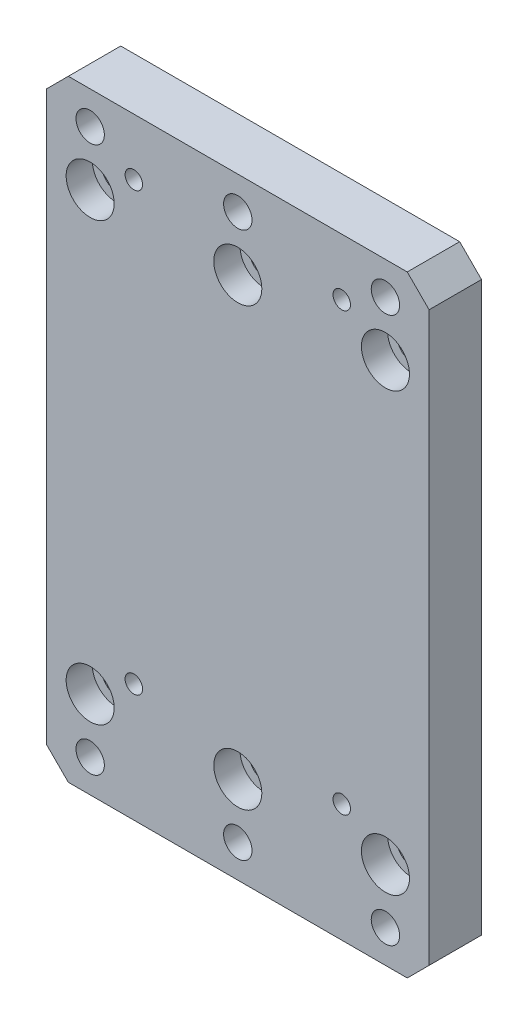
ISO-10303-21;
HEADER;
FILE_DESCRIPTION(('STEP AP214'),'2;1');
FILE_NAME('part.step','',(''),(''),'','','');
FILE_SCHEMA(('AUTOMOTIVE_DESIGN { 1 0 10303 214 1 1 1 1 }'));
ENDSEC;
DATA;
#1=APPLICATION_CONTEXT('core data for automotive mechanical design processes');
#2=APPLICATION_PROTOCOL_DEFINITION('international standard','automotive_design',2000,#1);
#3=PRODUCT_CONTEXT('',#1,'mechanical');
#4=PRODUCT('Part','Part','',(#3));
#5=PRODUCT_RELATED_PRODUCT_CATEGORY('part','',(#4));
#6=PRODUCT_DEFINITION_FORMATION('','',#4);
#7=PRODUCT_DEFINITION_CONTEXT('part definition',#1,'design');
#8=PRODUCT_DEFINITION('design','',#6,#7);
#9=PRODUCT_DEFINITION_SHAPE('','',#8);
#10=(LENGTH_UNIT() NAMED_UNIT(*) SI_UNIT(.MILLI.,.METRE.));
#11=(NAMED_UNIT(*) PLANE_ANGLE_UNIT() SI_UNIT($,.RADIAN.));
#12=(NAMED_UNIT(*) SI_UNIT($,.STERADIAN.) SOLID_ANGLE_UNIT());
#13=UNCERTAINTY_MEASURE_WITH_UNIT(LENGTH_MEASURE(1.E-05),#10,'distance_accuracy_value','');
#14=(GEOMETRIC_REPRESENTATION_CONTEXT(3) GLOBAL_UNCERTAINTY_ASSIGNED_CONTEXT((#13)) GLOBAL_UNIT_ASSIGNED_CONTEXT((#10,
#11,#12)) REPRESENTATION_CONTEXT('',''));
#15=CARTESIAN_POINT('',(0.,0.,0.));
#16=DIRECTION('',(0.,0.,1.));
#17=DIRECTION('',(1.,0.,0.));
#18=AXIS2_PLACEMENT_3D('',#15,#16,#17);
#19=CARTESIAN_POINT('',(43.8,-70.,12.));
#20=DIRECTION('',(-1.,0.,0.));
#21=DIRECTION('',(0.,0.,1.));
#22=AXIS2_PLACEMENT_3D('',#19,#20,#21);
#23=PLANE('',#22);
#24=DIRECTION('',(0.,1.,0.));
#25=VECTOR('',#24,1.);
#26=CARTESIAN_POINT('',(43.8,-70.,12.));
#27=LINE('',#26,#25);
#28=CARTESIAN_POINT('',(43.8,-65.,12.));
#29=VERTEX_POINT('',#28);
#30=CARTESIAN_POINT('',(43.8,65.,12.));
#31=VERTEX_POINT('',#30);
#32=EDGE_CURVE('E125',#29,#31,#27,.T.);
#33=ORIENTED_EDGE('',*,*,#32,.F.);
#34=DIRECTION('',(0.,0.,-1.));
#35=VECTOR('',#34,1.);
#36=CARTESIAN_POINT('',(43.8,-65.,12.));
#37=LINE('',#36,#35);
#38=CARTESIAN_POINT('',(43.8,-65.,0.));
#39=VERTEX_POINT('',#38);
#40=EDGE_CURVE('E151',#29,#39,#37,.T.);
#41=ORIENTED_EDGE('',*,*,#40,.T.);
#42=DIRECTION('',(0.,1.,0.));
#43=VECTOR('',#42,1.);
#44=CARTESIAN_POINT('',(43.8,-70.,0.));
#45=LINE('',#44,#43);
#46=CARTESIAN_POINT('',(43.8,65.,0.));
#47=VERTEX_POINT('',#46);
#48=EDGE_CURVE('E159',#39,#47,#45,.T.);
#49=ORIENTED_EDGE('',*,*,#48,.T.);
#50=DIRECTION('',(0.,0.,1.));
#51=VECTOR('',#50,1.);
#52=CARTESIAN_POINT('',(43.8,65.,12.));
#53=LINE('',#52,#51);
#54=EDGE_CURVE('E149',#47,#31,#53,.T.);
#55=ORIENTED_EDGE('',*,*,#54,.T.);
#56=EDGE_LOOP('',(#33,#41,#49,#55));
#57=FACE_BOUND('',#56,.T.);
#58=ADVANCED_FACE('F34',(#57),#23,.F.);
#59=CARTESIAN_POINT('',(-43.8,70.,12.));
#60=DIRECTION('',(0.,-1.,0.));
#61=DIRECTION('',(0.,0.,-1.));
#62=AXIS2_PLACEMENT_3D('',#59,#60,#61);
#63=PLANE('',#62);
#64=DIRECTION('',(-1.,0.,0.));
#65=VECTOR('',#64,1.);
#66=CARTESIAN_POINT('',(-43.8,70.,0.));
#67=LINE('',#66,#65);
#68=CARTESIAN_POINT('',(38.8,70.,0.));
#69=VERTEX_POINT('',#68);
#70=CARTESIAN_POINT('',(-38.8,70.,0.));
#71=VERTEX_POINT('',#70);
#72=EDGE_CURVE('E130',#69,#71,#67,.T.);
#73=ORIENTED_EDGE('',*,*,#72,.T.);
#74=DIRECTION('',(0.,0.,1.));
#75=VECTOR('',#74,1.);
#76=CARTESIAN_POINT('',(-38.8,70.,12.));
#77=LINE('',#76,#75);
#78=CARTESIAN_POINT('',(-38.8,70.,12.));
#79=VERTEX_POINT('',#78);
#80=EDGE_CURVE('E11',#71,#79,#77,.T.);
#81=ORIENTED_EDGE('',*,*,#80,.T.);
#82=DIRECTION('',(-1.,0.,0.));
#83=VECTOR('',#82,1.);
#84=CARTESIAN_POINT('',(-43.8,70.,12.));
#85=LINE('',#84,#83);
#86=CARTESIAN_POINT('',(38.8,70.,12.));
#87=VERTEX_POINT('',#86);
#88=EDGE_CURVE('E128',#87,#79,#85,.T.);
#89=ORIENTED_EDGE('',*,*,#88,.F.);
#90=DIRECTION('',(0.,0.,-1.));
#91=VECTOR('',#90,1.);
#92=CARTESIAN_POINT('',(38.8,70.,12.));
#93=LINE('',#92,#91);
#94=EDGE_CURVE('E42',#87,#69,#93,.T.);
#95=ORIENTED_EDGE('',*,*,#94,.T.);
#96=EDGE_LOOP('',(#73,#81,#89,#95));
#97=FACE_BOUND('',#96,.T.);
#98=ADVANCED_FACE('F156',(#97),#63,.F.);
#99=CARTESIAN_POINT('',(-43.8,-70.,12.));
#100=DIRECTION('',(1.,0.,0.));
#101=DIRECTION('',(0.,0.,-1.));
#102=AXIS2_PLACEMENT_3D('',#99,#100,#101);
#103=PLANE('',#102);
#104=DIRECTION('',(0.,-1.,0.));
#105=VECTOR('',#104,1.);
#106=CARTESIAN_POINT('',(-43.8,-70.,0.));
#107=LINE('',#106,#105);
#108=CARTESIAN_POINT('',(-43.8,65.,0.));
#109=VERTEX_POINT('',#108);
#110=CARTESIAN_POINT('',(-43.8,-65.,0.));
#111=VERTEX_POINT('',#110);
#112=EDGE_CURVE('E126',#109,#111,#107,.T.);
#113=ORIENTED_EDGE('',*,*,#112,.T.);
#114=DIRECTION('',(0.,0.,1.));
#115=VECTOR('',#114,1.);
#116=CARTESIAN_POINT('',(-43.8,-65.,12.));
#117=LINE('',#116,#115);
#118=CARTESIAN_POINT('',(-43.8,-65.,12.));
#119=VERTEX_POINT('',#118);
#120=EDGE_CURVE('E104',#111,#119,#117,.T.);
#121=ORIENTED_EDGE('',*,*,#120,.T.);
#122=DIRECTION('',(0.,-1.,0.));
#123=VECTOR('',#122,1.);
#124=CARTESIAN_POINT('',(-43.8,-70.,12.));
#125=LINE('',#124,#123);
#126=CARTESIAN_POINT('',(-43.8,65.,12.));
#127=VERTEX_POINT('',#126);
#128=EDGE_CURVE('E164',#127,#119,#125,.T.);
#129=ORIENTED_EDGE('',*,*,#128,.F.);
#130=DIRECTION('',(0.,0.,-1.));
#131=VECTOR('',#130,1.);
#132=CARTESIAN_POINT('',(-43.8,65.,12.));
#133=LINE('',#132,#131);
#134=EDGE_CURVE('E109',#127,#109,#133,.T.);
#135=ORIENTED_EDGE('',*,*,#134,.T.);
#136=EDGE_LOOP('',(#113,#121,#129,#135));
#137=FACE_BOUND('',#136,.T.);
#138=ADVANCED_FACE('F368',(#137),#103,.F.);
#139=CARTESIAN_POINT('',(-43.8,-70.,12.));
#140=DIRECTION('',(0.,1.,0.));
#141=DIRECTION('',(0.,0.,1.));
#142=AXIS2_PLACEMENT_3D('',#139,#140,#141);
#143=PLANE('',#142);
#144=DIRECTION('',(1.,0.,0.));
#145=VECTOR('',#144,1.);
#146=CARTESIAN_POINT('',(-43.8,-70.,12.));
#147=LINE('',#146,#145);
#148=CARTESIAN_POINT('',(-38.8,-70.,12.));
#149=VERTEX_POINT('',#148);
#150=CARTESIAN_POINT('',(38.8,-70.,12.));
#151=VERTEX_POINT('',#150);
#152=EDGE_CURVE('E119',#149,#151,#147,.T.);
#153=ORIENTED_EDGE('',*,*,#152,.F.);
#154=DIRECTION('',(0.,0.,-1.));
#155=VECTOR('',#154,1.);
#156=CARTESIAN_POINT('',(-38.8,-70.,12.));
#157=LINE('',#156,#155);
#158=CARTESIAN_POINT('',(-38.8,-70.,0.));
#159=VERTEX_POINT('',#158);
#160=EDGE_CURVE('E103',#149,#159,#157,.T.);
#161=ORIENTED_EDGE('',*,*,#160,.T.);
#162=DIRECTION('',(1.,0.,0.));
#163=VECTOR('',#162,1.);
#164=CARTESIAN_POINT('',(-43.8,-70.,0.));
#165=LINE('',#164,#163);
#166=CARTESIAN_POINT('',(38.8,-70.,0.));
#167=VERTEX_POINT('',#166);
#168=EDGE_CURVE('E116',#159,#167,#165,.T.);
#169=ORIENTED_EDGE('',*,*,#168,.T.);
#170=DIRECTION('',(0.,0.,1.));
#171=VECTOR('',#170,1.);
#172=CARTESIAN_POINT('',(38.8,-70.,12.));
#173=LINE('',#172,#171);
#174=EDGE_CURVE('E121',#167,#151,#173,.T.);
#175=ORIENTED_EDGE('',*,*,#174,.T.);
#176=EDGE_LOOP('',(#153,#161,#169,#175));
#177=FACE_BOUND('',#176,.T.);
#178=ADVANCED_FACE('F115',(#177),#143,.F.);
#179=CARTESIAN_POINT('',(43.8,70.,12.));
#180=DIRECTION('',(0.,0.,-1.));
#181=DIRECTION('',(-1.,0.,0.));
#182=AXIS2_PLACEMENT_3D('',#179,#180,#181);
#183=PLANE('',#182);
#184=CARTESIAN_POINT('',(33.8000000000068,-62.5,12.));
#185=DIRECTION('',(0.,0.,-1.));
#186=DIRECTION('',(-1.,0.,0.));
#187=AXIS2_PLACEMENT_3D('',#184,#185,#186);
#188=CIRCLE('',#187,3.25);
#189=CARTESIAN_POINT('',(30.5500000000068,-62.5,12.));
#190=VERTEX_POINT('',#189);
#191=EDGE_CURVE('E291',#190,#190,#188,.T.);
#192=ORIENTED_EDGE('',*,*,#191,.T.);
#193=EDGE_LOOP('',(#192));
#194=FACE_BOUND('',#193,.T.);
#195=CARTESIAN_POINT('',(-2.13963403938542E-13,-62.5,12.));
#196=DIRECTION('',(0.,0.,-1.));
#197=DIRECTION('',(-1.,0.,0.));
#198=AXIS2_PLACEMENT_3D('',#195,#196,#197);
#199=CIRCLE('',#198,3.25);
#200=CARTESIAN_POINT('',(-3.25000000000021,-62.5,12.));
#201=VERTEX_POINT('',#200);
#202=EDGE_CURVE('E285',#201,#201,#199,.T.);
#203=ORIENTED_EDGE('',*,*,#202,.T.);
#204=EDGE_LOOP('',(#203));
#205=FACE_BOUND('',#204,.T.);
#206=CARTESIAN_POINT('',(-33.8000000000068,-62.5,12.));
#207=DIRECTION('',(0.,0.,-1.));
#208=DIRECTION('',(-1.,0.,0.));
#209=AXIS2_PLACEMENT_3D('',#206,#207,#208);
#210=CIRCLE('',#209,3.25);
#211=CARTESIAN_POINT('',(-37.0500000000068,-62.5,12.));
#212=VERTEX_POINT('',#211);
#213=EDGE_CURVE('E279',#212,#212,#210,.T.);
#214=ORIENTED_EDGE('',*,*,#213,.T.);
#215=EDGE_LOOP('',(#214));
#216=FACE_BOUND('',#215,.T.);
#217=CARTESIAN_POINT('',(33.8000000000068,62.5,12.));
#218=DIRECTION('',(0.,0.,-1.));
#219=DIRECTION('',(-1.,0.,0.));
#220=AXIS2_PLACEMENT_3D('',#217,#218,#219);
#221=CIRCLE('',#220,3.25);
#222=CARTESIAN_POINT('',(30.5500000000068,62.5,12.));
#223=VERTEX_POINT('',#222);
#224=EDGE_CURVE('E273',#223,#223,#221,.T.);
#225=ORIENTED_EDGE('',*,*,#224,.T.);
#226=EDGE_LOOP('',(#225));
#227=FACE_BOUND('',#226,.T.);
#228=CARTESIAN_POINT('',(0.,62.5,12.));
#229=DIRECTION('',(0.,0.,-1.));
#230=DIRECTION('',(-1.,0.,0.));
#231=AXIS2_PLACEMENT_3D('',#228,#229,#230);
#232=CIRCLE('',#231,3.25);
#233=CARTESIAN_POINT('',(-3.25,62.5,12.));
#234=VERTEX_POINT('',#233);
#235=EDGE_CURVE('E267',#234,#234,#232,.T.);
#236=ORIENTED_EDGE('',*,*,#235,.T.);
#237=EDGE_LOOP('',(#236));
#238=FACE_BOUND('',#237,.T.);
#239=CARTESIAN_POINT('',(-33.8000000000068,62.5,12.));
#240=DIRECTION('',(0.,0.,-1.));
#241=DIRECTION('',(-1.,0.,0.));
#242=AXIS2_PLACEMENT_3D('',#239,#240,#241);
#243=CIRCLE('',#242,3.25);
#244=CARTESIAN_POINT('',(-37.0500000000068,62.5,12.));
#245=VERTEX_POINT('',#244);
#246=EDGE_CURVE('E261',#245,#245,#243,.T.);
#247=ORIENTED_EDGE('',*,*,#246,.T.);
#248=EDGE_LOOP('',(#247));
#249=FACE_BOUND('',#248,.T.);
#250=CARTESIAN_POINT('',(-23.7999999999971,-43.0000000000032,12.));
#251=DIRECTION('',(0.,0.,1.));
#252=DIRECTION('',(1.,0.,0.));
#253=AXIS2_PLACEMENT_3D('',#250,#251,#252);
#254=CIRCLE('',#253,2.);
#255=CARTESIAN_POINT('',(-21.7999999999971,-43.0000000000032,12.));
#256=VERTEX_POINT('',#255);
#257=EDGE_CURVE('E258',#256,#256,#254,.T.);
#258=ORIENTED_EDGE('',*,*,#257,.F.);
#259=EDGE_LOOP('',(#258));
#260=FACE_BOUND('',#259,.T.);
#261=CARTESIAN_POINT('',(23.7999999999971,-43.0000000000032,12.));
#262=DIRECTION('',(0.,0.,1.));
#263=DIRECTION('',(1.,0.,0.));
#264=AXIS2_PLACEMENT_3D('',#261,#262,#263);
#265=CIRCLE('',#264,2.);
#266=CARTESIAN_POINT('',(25.7999999999971,-43.0000000000032,12.));
#267=VERTEX_POINT('',#266);
#268=EDGE_CURVE('E252',#267,#267,#265,.T.);
#269=ORIENTED_EDGE('',*,*,#268,.F.);
#270=EDGE_LOOP('',(#269));
#271=FACE_BOUND('',#270,.T.);
#272=CARTESIAN_POINT('',(23.7999999999971,56.999999999994,12.));
#273=DIRECTION('',(0.,0.,1.));
#274=DIRECTION('',(1.,0.,0.));
#275=AXIS2_PLACEMENT_3D('',#272,#273,#274);
#276=CIRCLE('',#275,2.);
#277=CARTESIAN_POINT('',(25.7999999999971,56.999999999994,12.));
#278=VERTEX_POINT('',#277);
#279=EDGE_CURVE('E246',#278,#278,#276,.T.);
#280=ORIENTED_EDGE('',*,*,#279,.F.);
#281=EDGE_LOOP('',(#280));
#282=FACE_BOUND('',#281,.T.);
#283=CARTESIAN_POINT('',(-23.7999999999971,56.999999999994,12.));
#284=DIRECTION('',(0.,0.,1.));
#285=DIRECTION('',(1.,0.,0.));
#286=AXIS2_PLACEMENT_3D('',#283,#284,#285);
#287=CIRCLE('',#286,2.);
#288=CARTESIAN_POINT('',(-21.7999999999971,56.999999999994,12.));
#289=VERTEX_POINT('',#288);
#290=EDGE_CURVE('E240',#289,#289,#287,.T.);
#291=ORIENTED_EDGE('',*,*,#290,.F.);
#292=EDGE_LOOP('',(#291));
#293=FACE_BOUND('',#292,.T.);
#294=CARTESIAN_POINT('',(33.8,50.,12.));
#295=DIRECTION('',(0.,0.,1.));
#296=DIRECTION('',(1.,0.,0.));
#297=AXIS2_PLACEMENT_3D('',#294,#295,#296);
#298=CIRCLE('',#297,5.5);
#299=CARTESIAN_POINT('',(39.3,50.,12.));
#300=VERTEX_POINT('',#299);
#301=EDGE_CURVE('E236',#300,#300,#298,.T.);
#302=ORIENTED_EDGE('',*,*,#301,.F.);
#303=EDGE_LOOP('',(#302));
#304=FACE_BOUND('',#303,.T.);
#305=CARTESIAN_POINT('',(0.,50.,12.));
#306=DIRECTION('',(0.,0.,1.));
#307=DIRECTION('',(1.,0.,0.));
#308=AXIS2_PLACEMENT_3D('',#305,#306,#307);
#309=CIRCLE('',#308,5.5);
#310=CARTESIAN_POINT('',(5.50000000000002,50.,12.));
#311=VERTEX_POINT('',#310);
#312=EDGE_CURVE('E224',#311,#311,#309,.T.);
#313=ORIENTED_EDGE('',*,*,#312,.F.);
#314=EDGE_LOOP('',(#313));
#315=FACE_BOUND('',#314,.T.);
#316=CARTESIAN_POINT('',(-33.8,50.,12.));
#317=DIRECTION('',(0.,0.,1.));
#318=DIRECTION('',(1.,0.,0.));
#319=AXIS2_PLACEMENT_3D('',#316,#317,#318);
#320=CIRCLE('',#319,5.5);
#321=CARTESIAN_POINT('',(-28.3,50.,12.));
#322=VERTEX_POINT('',#321);
#323=EDGE_CURVE('E212',#322,#322,#320,.T.);
#324=ORIENTED_EDGE('',*,*,#323,.F.);
#325=EDGE_LOOP('',(#324));
#326=FACE_BOUND('',#325,.T.);
#327=CARTESIAN_POINT('',(-33.8,-50.,12.));
#328=DIRECTION('',(0.,0.,1.));
#329=DIRECTION('',(1.,0.,0.));
#330=AXIS2_PLACEMENT_3D('',#327,#328,#329);
#331=CIRCLE('',#330,5.5);
#332=CARTESIAN_POINT('',(-28.3,-50.,12.));
#333=VERTEX_POINT('',#332);
#334=EDGE_CURVE('E200',#333,#333,#331,.T.);
#335=ORIENTED_EDGE('',*,*,#334,.F.);
#336=EDGE_LOOP('',(#335));
#337=FACE_BOUND('',#336,.T.);
#338=CARTESIAN_POINT('',(0.,-50.,12.));
#339=DIRECTION('',(0.,0.,1.));
#340=DIRECTION('',(1.,0.,0.));
#341=AXIS2_PLACEMENT_3D('',#338,#339,#340);
#342=CIRCLE('',#341,5.5);
#343=CARTESIAN_POINT('',(5.50000000000003,-50.,12.));
#344=VERTEX_POINT('',#343);
#345=EDGE_CURVE('E188',#344,#344,#342,.T.);
#346=ORIENTED_EDGE('',*,*,#345,.F.);
#347=EDGE_LOOP('',(#346));
#348=FACE_BOUND('',#347,.T.);
#349=CARTESIAN_POINT('',(33.8,-50.,12.));
#350=DIRECTION('',(0.,0.,1.));
#351=DIRECTION('',(1.,0.,0.));
#352=AXIS2_PLACEMENT_3D('',#349,#350,#351);
#353=CIRCLE('',#352,5.5);
#354=CARTESIAN_POINT('',(39.3,-50.,12.));
#355=VERTEX_POINT('',#354);
#356=EDGE_CURVE('E176',#355,#355,#353,.T.);
#357=ORIENTED_EDGE('',*,*,#356,.F.);
#358=EDGE_LOOP('',(#357));
#359=FACE_BOUND('',#358,.T.);
#360=ORIENTED_EDGE('',*,*,#128,.T.);
#361=DIRECTION('',(-0.707106781186546,0.70710678118655,0.));
#362=VECTOR('',#361,1.);
#363=CARTESIAN_POINT('',(-38.8,-70.,12.));
#364=LINE('',#363,#362);
#365=EDGE_CURVE('E147',#119,#149,#364,.F.);
#366=ORIENTED_EDGE('',*,*,#365,.T.);
#367=ORIENTED_EDGE('',*,*,#152,.T.);
#368=DIRECTION('',(-0.70710678118655,-0.707106781186546,0.));
#369=VECTOR('',#368,1.);
#370=CARTESIAN_POINT('',(43.8,-65.,12.));
#371=LINE('',#370,#369);
#372=EDGE_CURVE('E145',#151,#29,#371,.F.);
#373=ORIENTED_EDGE('',*,*,#372,.T.);
#374=ORIENTED_EDGE('',*,*,#32,.T.);
#375=DIRECTION('',(0.707106781186546,-0.707106781186549,0.));
#376=VECTOR('',#375,1.);
#377=CARTESIAN_POINT('',(38.8,70.,12.));
#378=LINE('',#377,#376);
#379=EDGE_CURVE('E54',#31,#87,#378,.F.);
#380=ORIENTED_EDGE('',*,*,#379,.T.);
#381=ORIENTED_EDGE('',*,*,#88,.T.);
#382=DIRECTION('',(0.707106781186549,0.707106781186547,0.));
#383=VECTOR('',#382,1.);
#384=CARTESIAN_POINT('',(-43.8,65.,12.));
#385=LINE('',#384,#383);
#386=EDGE_CURVE('E143',#79,#127,#385,.F.);
#387=ORIENTED_EDGE('',*,*,#386,.T.);
#388=EDGE_LOOP('',(#360,#366,#367,#373,#374,#380,#381,#387));
#389=FACE_BOUND('',#388,.T.);
#390=ADVANCED_FACE('F300',(#194,#205,#216,#227,#238,#249,#260,#271,#282,#293,#304,#315,#326,
#337,#348,#359,#389),#183,.F.);
#391=CARTESIAN_POINT('',(43.8,70.,0.));
#392=DIRECTION('',(0.,0.,-1.));
#393=DIRECTION('',(-1.,0.,0.));
#394=AXIS2_PLACEMENT_3D('',#391,#392,#393);
#395=PLANE('',#394);
#396=CARTESIAN_POINT('',(33.8000000000068,-62.5,0.));
#397=DIRECTION('',(0.,0.,-1.));
#398=DIRECTION('',(-1.,0.,0.));
#399=AXIS2_PLACEMENT_3D('',#396,#397,#398);
#400=CIRCLE('',#399,3.25);
#401=CARTESIAN_POINT('',(30.5500000000068,-62.5,0.));
#402=VERTEX_POINT('',#401);
#403=EDGE_CURVE('E294',#402,#402,#400,.T.);
#404=ORIENTED_EDGE('',*,*,#403,.F.);
#405=EDGE_LOOP('',(#404));
#406=FACE_BOUND('',#405,.T.);
#407=CARTESIAN_POINT('',(-2.13963403938542E-13,-62.5,0.));
#408=DIRECTION('',(0.,0.,-1.));
#409=DIRECTION('',(-1.,0.,0.));
#410=AXIS2_PLACEMENT_3D('',#407,#408,#409);
#411=CIRCLE('',#410,3.25);
#412=CARTESIAN_POINT('',(-3.25000000000021,-62.5,0.));
#413=VERTEX_POINT('',#412);
#414=EDGE_CURVE('E288',#413,#413,#411,.T.);
#415=ORIENTED_EDGE('',*,*,#414,.F.);
#416=EDGE_LOOP('',(#415));
#417=FACE_BOUND('',#416,.T.);
#418=CARTESIAN_POINT('',(-33.8000000000068,-62.5,0.));
#419=DIRECTION('',(0.,0.,-1.));
#420=DIRECTION('',(-1.,0.,0.));
#421=AXIS2_PLACEMENT_3D('',#418,#419,#420);
#422=CIRCLE('',#421,3.25);
#423=CARTESIAN_POINT('',(-37.0500000000068,-62.5,0.));
#424=VERTEX_POINT('',#423);
#425=EDGE_CURVE('E282',#424,#424,#422,.T.);
#426=ORIENTED_EDGE('',*,*,#425,.F.);
#427=EDGE_LOOP('',(#426));
#428=FACE_BOUND('',#427,.T.);
#429=CARTESIAN_POINT('',(33.8000000000068,62.5,0.));
#430=DIRECTION('',(0.,0.,-1.));
#431=DIRECTION('',(-1.,0.,0.));
#432=AXIS2_PLACEMENT_3D('',#429,#430,#431);
#433=CIRCLE('',#432,3.25);
#434=CARTESIAN_POINT('',(30.5500000000068,62.5,0.));
#435=VERTEX_POINT('',#434);
#436=EDGE_CURVE('E276',#435,#435,#433,.T.);
#437=ORIENTED_EDGE('',*,*,#436,.F.);
#438=EDGE_LOOP('',(#437));
#439=FACE_BOUND('',#438,.T.);
#440=CARTESIAN_POINT('',(0.,62.5,0.));
#441=DIRECTION('',(0.,0.,-1.));
#442=DIRECTION('',(-1.,0.,0.));
#443=AXIS2_PLACEMENT_3D('',#440,#441,#442);
#444=CIRCLE('',#443,3.25);
#445=CARTESIAN_POINT('',(-3.25,62.5,0.));
#446=VERTEX_POINT('',#445);
#447=EDGE_CURVE('E270',#446,#446,#444,.T.);
#448=ORIENTED_EDGE('',*,*,#447,.F.);
#449=EDGE_LOOP('',(#448));
#450=FACE_BOUND('',#449,.T.);
#451=CARTESIAN_POINT('',(-33.8000000000068,62.5,0.));
#452=DIRECTION('',(0.,0.,-1.));
#453=DIRECTION('',(-1.,0.,0.));
#454=AXIS2_PLACEMENT_3D('',#451,#452,#453);
#455=CIRCLE('',#454,3.25);
#456=CARTESIAN_POINT('',(-37.0500000000068,62.5,0.));
#457=VERTEX_POINT('',#456);
#458=EDGE_CURVE('E264',#457,#457,#455,.T.);
#459=ORIENTED_EDGE('',*,*,#458,.F.);
#460=EDGE_LOOP('',(#459));
#461=FACE_BOUND('',#460,.T.);
#462=CARTESIAN_POINT('',(-23.7999999999971,-43.0000000000032,0.));
#463=DIRECTION('',(0.,0.,1.));
#464=DIRECTION('',(1.,0.,0.));
#465=AXIS2_PLACEMENT_3D('',#462,#463,#464);
#466=CIRCLE('',#465,2.);
#467=CARTESIAN_POINT('',(-21.7999999999971,-43.0000000000032,0.));
#468=VERTEX_POINT('',#467);
#469=EDGE_CURVE('E255',#468,#468,#466,.T.);
#470=ORIENTED_EDGE('',*,*,#469,.T.);
#471=EDGE_LOOP('',(#470));
#472=FACE_BOUND('',#471,.T.);
#473=CARTESIAN_POINT('',(23.7999999999971,-43.0000000000032,0.));
#474=DIRECTION('',(0.,0.,1.));
#475=DIRECTION('',(1.,0.,0.));
#476=AXIS2_PLACEMENT_3D('',#473,#474,#475);
#477=CIRCLE('',#476,2.);
#478=CARTESIAN_POINT('',(25.7999999999971,-43.0000000000032,0.));
#479=VERTEX_POINT('',#478);
#480=EDGE_CURVE('E249',#479,#479,#477,.T.);
#481=ORIENTED_EDGE('',*,*,#480,.T.);
#482=EDGE_LOOP('',(#481));
#483=FACE_BOUND('',#482,.T.);
#484=CARTESIAN_POINT('',(23.7999999999971,56.999999999994,0.));
#485=DIRECTION('',(0.,0.,1.));
#486=DIRECTION('',(1.,0.,0.));
#487=AXIS2_PLACEMENT_3D('',#484,#485,#486);
#488=CIRCLE('',#487,2.);
#489=CARTESIAN_POINT('',(25.7999999999971,56.999999999994,0.));
#490=VERTEX_POINT('',#489);
#491=EDGE_CURVE('E243',#490,#490,#488,.T.);
#492=ORIENTED_EDGE('',*,*,#491,.T.);
#493=EDGE_LOOP('',(#492));
#494=FACE_BOUND('',#493,.T.);
#495=CARTESIAN_POINT('',(-23.7999999999971,56.999999999994,0.));
#496=DIRECTION('',(0.,0.,1.));
#497=DIRECTION('',(1.,0.,0.));
#498=AXIS2_PLACEMENT_3D('',#495,#496,#497);
#499=CIRCLE('',#498,2.);
#500=CARTESIAN_POINT('',(-21.7999999999971,56.999999999994,0.));
#501=VERTEX_POINT('',#500);
#502=EDGE_CURVE('E239',#501,#501,#499,.T.);
#503=ORIENTED_EDGE('',*,*,#502,.T.);
#504=EDGE_LOOP('',(#503));
#505=FACE_BOUND('',#504,.T.);
#506=CARTESIAN_POINT('',(33.8,50.,0.));
#507=DIRECTION('',(0.,0.,1.));
#508=DIRECTION('',(1.,0.,0.));
#509=AXIS2_PLACEMENT_3D('',#506,#507,#508);
#510=CIRCLE('',#509,3.3);
#511=CARTESIAN_POINT('',(37.1,50.,0.));
#512=VERTEX_POINT('',#511);
#513=EDGE_CURVE('E227',#512,#512,#510,.T.);
#514=ORIENTED_EDGE('',*,*,#513,.T.);
#515=EDGE_LOOP('',(#514));
#516=FACE_BOUND('',#515,.T.);
#517=CARTESIAN_POINT('',(0.,50.,0.));
#518=DIRECTION('',(0.,0.,1.));
#519=DIRECTION('',(1.,0.,0.));
#520=AXIS2_PLACEMENT_3D('',#517,#518,#519);
#521=CIRCLE('',#520,3.3);
#522=CARTESIAN_POINT('',(3.30000000000002,50.,0.));
#523=VERTEX_POINT('',#522);
#524=EDGE_CURVE('E215',#523,#523,#521,.T.);
#525=ORIENTED_EDGE('',*,*,#524,.T.);
#526=EDGE_LOOP('',(#525));
#527=FACE_BOUND('',#526,.T.);
#528=CARTESIAN_POINT('',(-33.8,50.,0.));
#529=DIRECTION('',(0.,0.,1.));
#530=DIRECTION('',(1.,0.,0.));
#531=AXIS2_PLACEMENT_3D('',#528,#529,#530);
#532=CIRCLE('',#531,3.3);
#533=CARTESIAN_POINT('',(-30.5,50.,0.));
#534=VERTEX_POINT('',#533);
#535=EDGE_CURVE('E203',#534,#534,#532,.T.);
#536=ORIENTED_EDGE('',*,*,#535,.T.);
#537=EDGE_LOOP('',(#536));
#538=FACE_BOUND('',#537,.T.);
#539=CARTESIAN_POINT('',(-33.8,-50.,0.));
#540=DIRECTION('',(0.,0.,1.));
#541=DIRECTION('',(1.,0.,0.));
#542=AXIS2_PLACEMENT_3D('',#539,#540,#541);
#543=CIRCLE('',#542,3.3);
#544=CARTESIAN_POINT('',(-30.5,-50.,0.));
#545=VERTEX_POINT('',#544);
#546=EDGE_CURVE('E191',#545,#545,#543,.T.);
#547=ORIENTED_EDGE('',*,*,#546,.T.);
#548=EDGE_LOOP('',(#547));
#549=FACE_BOUND('',#548,.T.);
#550=CARTESIAN_POINT('',(0.,-50.,0.));
#551=DIRECTION('',(0.,0.,1.));
#552=DIRECTION('',(1.,0.,0.));
#553=AXIS2_PLACEMENT_3D('',#550,#551,#552);
#554=CIRCLE('',#553,3.3);
#555=CARTESIAN_POINT('',(3.30000000000003,-50.,0.));
#556=VERTEX_POINT('',#555);
#557=EDGE_CURVE('E179',#556,#556,#554,.T.);
#558=ORIENTED_EDGE('',*,*,#557,.T.);
#559=EDGE_LOOP('',(#558));
#560=FACE_BOUND('',#559,.T.);
#561=CARTESIAN_POINT('',(33.8,-50.,0.));
#562=DIRECTION('',(0.,0.,1.));
#563=DIRECTION('',(1.,0.,0.));
#564=AXIS2_PLACEMENT_3D('',#561,#562,#563);
#565=CIRCLE('',#564,3.3);
#566=CARTESIAN_POINT('',(37.1,-50.,0.));
#567=VERTEX_POINT('',#566);
#568=EDGE_CURVE('E160',#567,#567,#565,.T.);
#569=ORIENTED_EDGE('',*,*,#568,.T.);
#570=EDGE_LOOP('',(#569));
#571=FACE_BOUND('',#570,.T.);
#572=ORIENTED_EDGE('',*,*,#168,.F.);
#573=DIRECTION('',(0.707106781186546,-0.70710678118655,0.));
#574=VECTOR('',#573,1.);
#575=CARTESIAN_POINT('',(-67.5000000000002,-41.2999999999996,0.));
#576=LINE('',#575,#574);
#577=EDGE_CURVE('E99',#159,#111,#576,.F.);
#578=ORIENTED_EDGE('',*,*,#577,.T.);
#579=ORIENTED_EDGE('',*,*,#112,.F.);
#580=DIRECTION('',(-0.707106781186549,-0.707106781186547,0.));
#581=VECTOR('',#580,1.);
#582=CARTESIAN_POINT('',(2.50000000000013,111.3,0.));
#583=LINE('',#582,#581);
#584=EDGE_CURVE('E136',#109,#71,#583,.F.);
#585=ORIENTED_EDGE('',*,*,#584,.T.);
#586=ORIENTED_EDGE('',*,*,#72,.F.);
#587=DIRECTION('',(-0.707106781186546,0.707106781186549,0.));
#588=VECTOR('',#587,1.);
#589=CARTESIAN_POINT('',(41.3,67.5,0.));
#590=LINE('',#589,#588);
#591=EDGE_CURVE('E120',#69,#47,#590,.F.);
#592=ORIENTED_EDGE('',*,*,#591,.T.);
#593=ORIENTED_EDGE('',*,*,#48,.F.);
#594=DIRECTION('',(0.70710678118655,0.707106781186546,0.));
#595=VECTOR('',#594,1.);
#596=CARTESIAN_POINT('',(111.3,2.49999999999961,0.));
#597=LINE('',#596,#595);
#598=EDGE_CURVE('E110',#39,#167,#597,.F.);
#599=ORIENTED_EDGE('',*,*,#598,.T.);
#600=EDGE_LOOP('',(#572,#578,#579,#585,#586,#592,#593,#599));
#601=FACE_BOUND('',#600,.T.);
#602=ADVANCED_FACE('F123',(#406,#417,#428,#439,#450,#461,#472,#483,#494,#505,#516,#527,#538,
#549,#560,#571,#601),#395,.T.);
#603=CARTESIAN_POINT('',(-38.8,-70.,12.));
#604=DIRECTION('',(0.707106781186549,0.707106781186545,0.));
#605=DIRECTION('',(-0.707106781186546,0.70710678118655,0.));
#606=AXIS2_PLACEMENT_3D('',#603,#604,#605);
#607=PLANE('',#606);
#608=ORIENTED_EDGE('',*,*,#365,.F.);
#609=ORIENTED_EDGE('',*,*,#120,.F.);
#610=ORIENTED_EDGE('',*,*,#577,.F.);
#611=ORIENTED_EDGE('',*,*,#160,.F.);
#612=EDGE_LOOP('',(#608,#609,#610,#611));
#613=FACE_BOUND('',#612,.T.);
#614=ADVANCED_FACE('F102',(#613),#607,.F.);
#615=CARTESIAN_POINT('',(43.8,-65.,12.));
#616=DIRECTION('',(-0.707106781186545,0.707106781186549,0.));
#617=DIRECTION('',(-0.70710678118655,-0.707106781186546,0.));
#618=AXIS2_PLACEMENT_3D('',#615,#616,#617);
#619=PLANE('',#618);
#620=ORIENTED_EDGE('',*,*,#372,.F.);
#621=ORIENTED_EDGE('',*,*,#174,.F.);
#622=ORIENTED_EDGE('',*,*,#598,.F.);
#623=ORIENTED_EDGE('',*,*,#40,.F.);
#624=EDGE_LOOP('',(#620,#621,#622,#623));
#625=FACE_BOUND('',#624,.T.);
#626=ADVANCED_FACE('F372',(#625),#619,.F.);
#627=CARTESIAN_POINT('',(-43.8,65.,12.));
#628=DIRECTION('',(0.707106781186547,-0.707106781186549,0.));
#629=DIRECTION('',(0.707106781186549,0.707106781186547,0.));
#630=AXIS2_PLACEMENT_3D('',#627,#628,#629);
#631=PLANE('',#630);
#632=ORIENTED_EDGE('',*,*,#386,.F.);
#633=ORIENTED_EDGE('',*,*,#80,.F.);
#634=ORIENTED_EDGE('',*,*,#584,.F.);
#635=ORIENTED_EDGE('',*,*,#134,.F.);
#636=EDGE_LOOP('',(#632,#633,#634,#635));
#637=FACE_BOUND('',#636,.T.);
#638=ADVANCED_FACE('F370',(#637),#631,.F.);
#639=CARTESIAN_POINT('',(38.8,70.,12.));
#640=DIRECTION('',(-0.707106781186549,-0.707106781186546,0.));
#641=DIRECTION('',(0.707106781186546,-0.707106781186549,0.));
#642=AXIS2_PLACEMENT_3D('',#639,#640,#641);
#643=PLANE('',#642);
#644=ORIENTED_EDGE('',*,*,#379,.F.);
#645=ORIENTED_EDGE('',*,*,#54,.F.);
#646=ORIENTED_EDGE('',*,*,#591,.F.);
#647=ORIENTED_EDGE('',*,*,#94,.F.);
#648=EDGE_LOOP('',(#644,#645,#646,#647));
#649=FACE_BOUND('',#648,.T.);
#650=ADVANCED_FACE('F36',(#649),#643,.F.);
#651=CARTESIAN_POINT('',(33.8,-50.,12.));
#652=DIRECTION('',(0.,0.,1.));
#653=DIRECTION('',(1.,0.,0.));
#654=AXIS2_PLACEMENT_3D('',#651,#652,#653);
#655=CYLINDRICAL_SURFACE('',#654,3.3);
#656=ORIENTED_EDGE('',*,*,#568,.F.);
#657=EDGE_LOOP('',(#656));
#658=FACE_BOUND('',#657,.T.);
#659=CARTESIAN_POINT('',(33.8,-50.,6.));
#660=DIRECTION('',(0.,0.,1.));
#661=DIRECTION('',(1.,0.,0.));
#662=AXIS2_PLACEMENT_3D('',#659,#660,#661);
#663=CIRCLE('',#662,3.3);
#664=CARTESIAN_POINT('',(37.1,-50.,6.));
#665=VERTEX_POINT('',#664);
#666=EDGE_CURVE('E170',#665,#665,#663,.T.);
#667=ORIENTED_EDGE('',*,*,#666,.T.);
#668=EDGE_LOOP('',(#667));
#669=FACE_BOUND('',#668,.T.);
#670=ADVANCED_FACE('F343',(#658,#669),#655,.F.);
#671=CARTESIAN_POINT('',(37.1,-50.,6.));
#672=DIRECTION('',(0.,0.,-1.));
#673=DIRECTION('',(-1.,0.,0.));
#674=AXIS2_PLACEMENT_3D('',#671,#672,#673);
#675=PLANE('',#674);
#676=ORIENTED_EDGE('',*,*,#666,.F.);
#677=EDGE_LOOP('',(#676));
#678=FACE_BOUND('',#677,.T.);
#679=CARTESIAN_POINT('',(33.8,-50.,6.));
#680=DIRECTION('',(0.,0.,1.));
#681=DIRECTION('',(1.,0.,0.));
#682=AXIS2_PLACEMENT_3D('',#679,#680,#681);
#683=CIRCLE('',#682,5.5);
#684=CARTESIAN_POINT('',(39.3,-50.,6.));
#685=VERTEX_POINT('',#684);
#686=EDGE_CURVE('E173',#685,#685,#683,.T.);
#687=ORIENTED_EDGE('',*,*,#686,.T.);
#688=EDGE_LOOP('',(#687));
#689=FACE_BOUND('',#688,.T.);
#690=ADVANCED_FACE('F346',(#678,#689),#675,.F.);
#691=CARTESIAN_POINT('',(33.8,-50.,12.));
#692=DIRECTION('',(0.,0.,1.));
#693=DIRECTION('',(1.,0.,0.));
#694=AXIS2_PLACEMENT_3D('',#691,#692,#693);
#695=CYLINDRICAL_SURFACE('',#694,5.5);
#696=ORIENTED_EDGE('',*,*,#686,.F.);
#697=EDGE_LOOP('',(#696));
#698=FACE_BOUND('',#697,.T.);
#699=ORIENTED_EDGE('',*,*,#356,.T.);
#700=EDGE_LOOP('',(#699));
#701=FACE_BOUND('',#700,.T.);
#702=ADVANCED_FACE('F352',(#698,#701),#695,.F.);
#703=CARTESIAN_POINT('',(0.,-50.,12.));
#704=DIRECTION('',(0.,0.,1.));
#705=DIRECTION('',(1.,0.,0.));
#706=AXIS2_PLACEMENT_3D('',#703,#704,#705);
#707=CYLINDRICAL_SURFACE('',#706,3.3);
#708=ORIENTED_EDGE('',*,*,#557,.F.);
#709=EDGE_LOOP('',(#708));
#710=FACE_BOUND('',#709,.T.);
#711=CARTESIAN_POINT('',(0.,-50.,6.));
#712=DIRECTION('',(0.,0.,1.));
#713=DIRECTION('',(1.,0.,0.));
#714=AXIS2_PLACEMENT_3D('',#711,#712,#713);
#715=CIRCLE('',#714,3.3);
#716=CARTESIAN_POINT('',(3.30000000000003,-50.,6.));
#717=VERTEX_POINT('',#716);
#718=EDGE_CURVE('E182',#717,#717,#715,.T.);
#719=ORIENTED_EDGE('',*,*,#718,.T.);
#720=EDGE_LOOP('',(#719));
#721=FACE_BOUND('',#720,.T.);
#722=ADVANCED_FACE('F358',(#710,#721),#707,.F.);
#723=CARTESIAN_POINT('',(3.30000000000003,-50.,6.));
#724=DIRECTION('',(0.,0.,-1.));
#725=DIRECTION('',(-1.,0.,0.));
#726=AXIS2_PLACEMENT_3D('',#723,#724,#725);
#727=PLANE('',#726);
#728=ORIENTED_EDGE('',*,*,#718,.F.);
#729=EDGE_LOOP('',(#728));
#730=FACE_BOUND('',#729,.T.);
#731=CARTESIAN_POINT('',(0.,-50.,6.));
#732=DIRECTION('',(0.,0.,1.));
#733=DIRECTION('',(1.,0.,0.));
#734=AXIS2_PLACEMENT_3D('',#731,#732,#733);
#735=CIRCLE('',#734,5.5);
#736=CARTESIAN_POINT('',(5.50000000000003,-50.,6.));
#737=VERTEX_POINT('',#736);
#738=EDGE_CURVE('E185',#737,#737,#735,.T.);
#739=ORIENTED_EDGE('',*,*,#738,.T.);
#740=EDGE_LOOP('',(#739));
#741=FACE_BOUND('',#740,.T.);
#742=ADVANCED_FACE('F435',(#730,#741),#727,.F.);
#743=CARTESIAN_POINT('',(0.,-50.,12.));
#744=DIRECTION('',(0.,0.,1.));
#745=DIRECTION('',(1.,0.,0.));
#746=AXIS2_PLACEMENT_3D('',#743,#744,#745);
#747=CYLINDRICAL_SURFACE('',#746,5.5);
#748=ORIENTED_EDGE('',*,*,#738,.F.);
#749=EDGE_LOOP('',(#748));
#750=FACE_BOUND('',#749,.T.);
#751=ORIENTED_EDGE('',*,*,#345,.T.);
#752=EDGE_LOOP('',(#751));
#753=FACE_BOUND('',#752,.T.);
#754=ADVANCED_FACE('F445',(#750,#753),#747,.F.);
#755=CARTESIAN_POINT('',(-33.8,-50.,12.));
#756=DIRECTION('',(0.,0.,1.));
#757=DIRECTION('',(1.,0.,0.));
#758=AXIS2_PLACEMENT_3D('',#755,#756,#757);
#759=CYLINDRICAL_SURFACE('',#758,3.3);
#760=ORIENTED_EDGE('',*,*,#546,.F.);
#761=EDGE_LOOP('',(#760));
#762=FACE_BOUND('',#761,.T.);
#763=CARTESIAN_POINT('',(-33.8,-50.,6.));
#764=DIRECTION('',(0.,0.,1.));
#765=DIRECTION('',(1.,0.,0.));
#766=AXIS2_PLACEMENT_3D('',#763,#764,#765);
#767=CIRCLE('',#766,3.3);
#768=CARTESIAN_POINT('',(-30.5,-50.,6.));
#769=VERTEX_POINT('',#768);
#770=EDGE_CURVE('E194',#769,#769,#767,.T.);
#771=ORIENTED_EDGE('',*,*,#770,.T.);
#772=EDGE_LOOP('',(#771));
#773=FACE_BOUND('',#772,.T.);
#774=ADVANCED_FACE('F455',(#762,#773),#759,.F.);
#775=CARTESIAN_POINT('',(-30.5,-50.,6.));
#776=DIRECTION('',(0.,0.,-1.));
#777=DIRECTION('',(-1.,0.,0.));
#778=AXIS2_PLACEMENT_3D('',#775,#776,#777);
#779=PLANE('',#778);
#780=ORIENTED_EDGE('',*,*,#770,.F.);
#781=EDGE_LOOP('',(#780));
#782=FACE_BOUND('',#781,.T.);
#783=CARTESIAN_POINT('',(-33.8,-50.,6.));
#784=DIRECTION('',(0.,0.,1.));
#785=DIRECTION('',(1.,0.,0.));
#786=AXIS2_PLACEMENT_3D('',#783,#784,#785);
#787=CIRCLE('',#786,5.5);
#788=CARTESIAN_POINT('',(-28.3,-50.,6.));
#789=VERTEX_POINT('',#788);
#790=EDGE_CURVE('E197',#789,#789,#787,.T.);
#791=ORIENTED_EDGE('',*,*,#790,.T.);
#792=EDGE_LOOP('',(#791));
#793=FACE_BOUND('',#792,.T.);
#794=ADVANCED_FACE('F465',(#782,#793),#779,.F.);
#795=CARTESIAN_POINT('',(-33.8,-50.,12.));
#796=DIRECTION('',(0.,0.,1.));
#797=DIRECTION('',(1.,0.,0.));
#798=AXIS2_PLACEMENT_3D('',#795,#796,#797);
#799=CYLINDRICAL_SURFACE('',#798,5.5);
#800=ORIENTED_EDGE('',*,*,#790,.F.);
#801=EDGE_LOOP('',(#800));
#802=FACE_BOUND('',#801,.T.);
#803=ORIENTED_EDGE('',*,*,#334,.T.);
#804=EDGE_LOOP('',(#803));
#805=FACE_BOUND('',#804,.T.);
#806=ADVANCED_FACE('F475',(#802,#805),#799,.F.);
#807=CARTESIAN_POINT('',(-33.8,50.,12.));
#808=DIRECTION('',(0.,0.,1.));
#809=DIRECTION('',(1.,0.,0.));
#810=AXIS2_PLACEMENT_3D('',#807,#808,#809);
#811=CYLINDRICAL_SURFACE('',#810,3.3);
#812=ORIENTED_EDGE('',*,*,#535,.F.);
#813=EDGE_LOOP('',(#812));
#814=FACE_BOUND('',#813,.T.);
#815=CARTESIAN_POINT('',(-33.8,50.,6.));
#816=DIRECTION('',(0.,0.,1.));
#817=DIRECTION('',(1.,0.,0.));
#818=AXIS2_PLACEMENT_3D('',#815,#816,#817);
#819=CIRCLE('',#818,3.3);
#820=CARTESIAN_POINT('',(-30.5,50.,6.));
#821=VERTEX_POINT('',#820);
#822=EDGE_CURVE('E206',#821,#821,#819,.T.);
#823=ORIENTED_EDGE('',*,*,#822,.T.);
#824=EDGE_LOOP('',(#823));
#825=FACE_BOUND('',#824,.T.);
#826=ADVANCED_FACE('F485',(#814,#825),#811,.F.);
#827=CARTESIAN_POINT('',(-30.5,50.,6.));
#828=DIRECTION('',(0.,0.,-1.));
#829=DIRECTION('',(-1.,0.,0.));
#830=AXIS2_PLACEMENT_3D('',#827,#828,#829);
#831=PLANE('',#830);
#832=ORIENTED_EDGE('',*,*,#822,.F.);
#833=EDGE_LOOP('',(#832));
#834=FACE_BOUND('',#833,.T.);
#835=CARTESIAN_POINT('',(-33.8,50.,6.));
#836=DIRECTION('',(0.,0.,1.));
#837=DIRECTION('',(1.,0.,0.));
#838=AXIS2_PLACEMENT_3D('',#835,#836,#837);
#839=CIRCLE('',#838,5.5);
#840=CARTESIAN_POINT('',(-28.3,50.,6.));
#841=VERTEX_POINT('',#840);
#842=EDGE_CURVE('E209',#841,#841,#839,.T.);
#843=ORIENTED_EDGE('',*,*,#842,.T.);
#844=EDGE_LOOP('',(#843));
#845=FACE_BOUND('',#844,.T.);
#846=ADVANCED_FACE('F495',(#834,#845),#831,.F.);
#847=CARTESIAN_POINT('',(-33.8,50.,12.));
#848=DIRECTION('',(0.,0.,1.));
#849=DIRECTION('',(1.,0.,0.));
#850=AXIS2_PLACEMENT_3D('',#847,#848,#849);
#851=CYLINDRICAL_SURFACE('',#850,5.5);
#852=ORIENTED_EDGE('',*,*,#842,.F.);
#853=EDGE_LOOP('',(#852));
#854=FACE_BOUND('',#853,.T.);
#855=ORIENTED_EDGE('',*,*,#323,.T.);
#856=EDGE_LOOP('',(#855));
#857=FACE_BOUND('',#856,.T.);
#858=ADVANCED_FACE('F505',(#854,#857),#851,.F.);
#859=CARTESIAN_POINT('',(0.,50.,12.));
#860=DIRECTION('',(0.,0.,1.));
#861=DIRECTION('',(1.,0.,0.));
#862=AXIS2_PLACEMENT_3D('',#859,#860,#861);
#863=CYLINDRICAL_SURFACE('',#862,3.3);
#864=ORIENTED_EDGE('',*,*,#524,.F.);
#865=EDGE_LOOP('',(#864));
#866=FACE_BOUND('',#865,.T.);
#867=CARTESIAN_POINT('',(0.,50.,6.));
#868=DIRECTION('',(0.,0.,1.));
#869=DIRECTION('',(1.,0.,0.));
#870=AXIS2_PLACEMENT_3D('',#867,#868,#869);
#871=CIRCLE('',#870,3.3);
#872=CARTESIAN_POINT('',(3.30000000000002,50.,6.));
#873=VERTEX_POINT('',#872);
#874=EDGE_CURVE('E218',#873,#873,#871,.T.);
#875=ORIENTED_EDGE('',*,*,#874,.T.);
#876=EDGE_LOOP('',(#875));
#877=FACE_BOUND('',#876,.T.);
#878=ADVANCED_FACE('F515',(#866,#877),#863,.F.);
#879=CARTESIAN_POINT('',(3.30000000000002,50.,6.));
#880=DIRECTION('',(0.,0.,-1.));
#881=DIRECTION('',(-1.,0.,0.));
#882=AXIS2_PLACEMENT_3D('',#879,#880,#881);
#883=PLANE('',#882);
#884=ORIENTED_EDGE('',*,*,#874,.F.);
#885=EDGE_LOOP('',(#884));
#886=FACE_BOUND('',#885,.T.);
#887=CARTESIAN_POINT('',(0.,50.,6.));
#888=DIRECTION('',(0.,0.,1.));
#889=DIRECTION('',(1.,0.,0.));
#890=AXIS2_PLACEMENT_3D('',#887,#888,#889);
#891=CIRCLE('',#890,5.5);
#892=CARTESIAN_POINT('',(5.50000000000002,50.,6.));
#893=VERTEX_POINT('',#892);
#894=EDGE_CURVE('E221',#893,#893,#891,.T.);
#895=ORIENTED_EDGE('',*,*,#894,.T.);
#896=EDGE_LOOP('',(#895));
#897=FACE_BOUND('',#896,.T.);
#898=ADVANCED_FACE('F525',(#886,#897),#883,.F.);
#899=CARTESIAN_POINT('',(0.,50.,12.));
#900=DIRECTION('',(0.,0.,1.));
#901=DIRECTION('',(1.,0.,0.));
#902=AXIS2_PLACEMENT_3D('',#899,#900,#901);
#903=CYLINDRICAL_SURFACE('',#902,5.5);
#904=ORIENTED_EDGE('',*,*,#894,.F.);
#905=EDGE_LOOP('',(#904));
#906=FACE_BOUND('',#905,.T.);
#907=ORIENTED_EDGE('',*,*,#312,.T.);
#908=EDGE_LOOP('',(#907));
#909=FACE_BOUND('',#908,.T.);
#910=ADVANCED_FACE('F535',(#906,#909),#903,.F.);
#911=CARTESIAN_POINT('',(33.8,50.,12.));
#912=DIRECTION('',(0.,0.,1.));
#913=DIRECTION('',(1.,0.,0.));
#914=AXIS2_PLACEMENT_3D('',#911,#912,#913);
#915=CYLINDRICAL_SURFACE('',#914,3.3);
#916=ORIENTED_EDGE('',*,*,#513,.F.);
#917=EDGE_LOOP('',(#916));
#918=FACE_BOUND('',#917,.T.);
#919=CARTESIAN_POINT('',(33.8,50.,6.));
#920=DIRECTION('',(0.,0.,1.));
#921=DIRECTION('',(1.,0.,0.));
#922=AXIS2_PLACEMENT_3D('',#919,#920,#921);
#923=CIRCLE('',#922,3.3);
#924=CARTESIAN_POINT('',(37.1,50.,6.));
#925=VERTEX_POINT('',#924);
#926=EDGE_CURVE('E230',#925,#925,#923,.T.);
#927=ORIENTED_EDGE('',*,*,#926,.T.);
#928=EDGE_LOOP('',(#927));
#929=FACE_BOUND('',#928,.T.);
#930=ADVANCED_FACE('F545',(#918,#929),#915,.F.);
#931=CARTESIAN_POINT('',(37.1,50.,6.));
#932=DIRECTION('',(0.,0.,-1.));
#933=DIRECTION('',(-1.,0.,0.));
#934=AXIS2_PLACEMENT_3D('',#931,#932,#933);
#935=PLANE('',#934);
#936=ORIENTED_EDGE('',*,*,#926,.F.);
#937=EDGE_LOOP('',(#936));
#938=FACE_BOUND('',#937,.T.);
#939=CARTESIAN_POINT('',(33.8,50.,6.));
#940=DIRECTION('',(0.,0.,1.));
#941=DIRECTION('',(1.,0.,0.));
#942=AXIS2_PLACEMENT_3D('',#939,#940,#941);
#943=CIRCLE('',#942,5.5);
#944=CARTESIAN_POINT('',(39.3,50.,6.));
#945=VERTEX_POINT('',#944);
#946=EDGE_CURVE('E233',#945,#945,#943,.T.);
#947=ORIENTED_EDGE('',*,*,#946,.T.);
#948=EDGE_LOOP('',(#947));
#949=FACE_BOUND('',#948,.T.);
#950=ADVANCED_FACE('F555',(#938,#949),#935,.F.);
#951=CARTESIAN_POINT('',(33.8,50.,12.));
#952=DIRECTION('',(0.,0.,1.));
#953=DIRECTION('',(1.,0.,0.));
#954=AXIS2_PLACEMENT_3D('',#951,#952,#953);
#955=CYLINDRICAL_SURFACE('',#954,5.5);
#956=ORIENTED_EDGE('',*,*,#946,.F.);
#957=EDGE_LOOP('',(#956));
#958=FACE_BOUND('',#957,.T.);
#959=ORIENTED_EDGE('',*,*,#301,.T.);
#960=EDGE_LOOP('',(#959));
#961=FACE_BOUND('',#960,.T.);
#962=ADVANCED_FACE('F565',(#958,#961),#955,.F.);
#963=CARTESIAN_POINT('',(-23.7999999999971,56.999999999994,0.));
#964=DIRECTION('',(0.,0.,1.));
#965=DIRECTION('',(1.,0.,0.));
#966=AXIS2_PLACEMENT_3D('',#963,#964,#965);
#967=CYLINDRICAL_SURFACE('',#966,2.);
#968=ORIENTED_EDGE('',*,*,#502,.F.);
#969=EDGE_LOOP('',(#968));
#970=FACE_BOUND('',#969,.T.);
#971=ORIENTED_EDGE('',*,*,#290,.T.);
#972=EDGE_LOOP('',(#971));
#973=FACE_BOUND('',#972,.T.);
#974=ADVANCED_FACE('F575',(#970,#973),#967,.F.);
#975=CARTESIAN_POINT('',(23.7999999999971,56.999999999994,0.));
#976=DIRECTION('',(0.,0.,1.));
#977=DIRECTION('',(1.,0.,0.));
#978=AXIS2_PLACEMENT_3D('',#975,#976,#977);
#979=CYLINDRICAL_SURFACE('',#978,2.);
#980=ORIENTED_EDGE('',*,*,#491,.F.);
#981=EDGE_LOOP('',(#980));
#982=FACE_BOUND('',#981,.T.);
#983=ORIENTED_EDGE('',*,*,#279,.T.);
#984=EDGE_LOOP('',(#983));
#985=FACE_BOUND('',#984,.T.);
#986=ADVANCED_FACE('F585',(#982,#985),#979,.F.);
#987=CARTESIAN_POINT('',(23.7999999999971,-43.0000000000032,0.));
#988=DIRECTION('',(0.,0.,1.));
#989=DIRECTION('',(1.,0.,0.));
#990=AXIS2_PLACEMENT_3D('',#987,#988,#989);
#991=CYLINDRICAL_SURFACE('',#990,2.);
#992=ORIENTED_EDGE('',*,*,#480,.F.);
#993=EDGE_LOOP('',(#992));
#994=FACE_BOUND('',#993,.T.);
#995=ORIENTED_EDGE('',*,*,#268,.T.);
#996=EDGE_LOOP('',(#995));
#997=FACE_BOUND('',#996,.T.);
#998=ADVANCED_FACE('F595',(#994,#997),#991,.F.);
#999=CARTESIAN_POINT('',(-23.7999999999971,-43.0000000000032,0.));
#1000=DIRECTION('',(0.,0.,1.));
#1001=DIRECTION('',(1.,0.,0.));
#1002=AXIS2_PLACEMENT_3D('',#999,#1000,#1001);
#1003=CYLINDRICAL_SURFACE('',#1002,2.);
#1004=ORIENTED_EDGE('',*,*,#469,.F.);
#1005=EDGE_LOOP('',(#1004));
#1006=FACE_BOUND('',#1005,.T.);
#1007=ORIENTED_EDGE('',*,*,#257,.T.);
#1008=EDGE_LOOP('',(#1007));
#1009=FACE_BOUND('',#1008,.T.);
#1010=ADVANCED_FACE('F605',(#1006,#1009),#1003,.F.);
#1011=CARTESIAN_POINT('',(-33.8000000000068,62.5,12.));
#1012=DIRECTION('',(0.,0.,-1.));
#1013=DIRECTION('',(-1.,0.,0.));
#1014=AXIS2_PLACEMENT_3D('',#1011,#1012,#1013);
#1015=CYLINDRICAL_SURFACE('',#1014,3.25);
#1016=ORIENTED_EDGE('',*,*,#246,.F.);
#1017=EDGE_LOOP('',(#1016));
#1018=FACE_BOUND('',#1017,.T.);
#1019=ORIENTED_EDGE('',*,*,#458,.T.);
#1020=EDGE_LOOP('',(#1019));
#1021=FACE_BOUND('',#1020,.T.);
#1022=ADVANCED_FACE('F615',(#1018,#1021),#1015,.F.);
#1023=CARTESIAN_POINT('',(0.,62.5,12.));
#1024=DIRECTION('',(0.,0.,-1.));
#1025=DIRECTION('',(-1.,0.,0.));
#1026=AXIS2_PLACEMENT_3D('',#1023,#1024,#1025);
#1027=CYLINDRICAL_SURFACE('',#1026,3.25);
#1028=ORIENTED_EDGE('',*,*,#235,.F.);
#1029=EDGE_LOOP('',(#1028));
#1030=FACE_BOUND('',#1029,.T.);
#1031=ORIENTED_EDGE('',*,*,#447,.T.);
#1032=EDGE_LOOP('',(#1031));
#1033=FACE_BOUND('',#1032,.T.);
#1034=ADVANCED_FACE('F626',(#1030,#1033),#1027,.F.);
#1035=CARTESIAN_POINT('',(33.8000000000068,62.5,12.));
#1036=DIRECTION('',(0.,0.,-1.));
#1037=DIRECTION('',(-1.,0.,0.));
#1038=AXIS2_PLACEMENT_3D('',#1035,#1036,#1037);
#1039=CYLINDRICAL_SURFACE('',#1038,3.25);
#1040=ORIENTED_EDGE('',*,*,#224,.F.);
#1041=EDGE_LOOP('',(#1040));
#1042=FACE_BOUND('',#1041,.T.);
#1043=ORIENTED_EDGE('',*,*,#436,.T.);
#1044=EDGE_LOOP('',(#1043));
#1045=FACE_BOUND('',#1044,.T.);
#1046=ADVANCED_FACE('F637',(#1042,#1045),#1039,.F.);
#1047=CARTESIAN_POINT('',(-33.8000000000068,-62.5,12.));
#1048=DIRECTION('',(0.,0.,-1.));
#1049=DIRECTION('',(-1.,0.,0.));
#1050=AXIS2_PLACEMENT_3D('',#1047,#1048,#1049);
#1051=CYLINDRICAL_SURFACE('',#1050,3.25);
#1052=ORIENTED_EDGE('',*,*,#213,.F.);
#1053=EDGE_LOOP('',(#1052));
#1054=FACE_BOUND('',#1053,.T.);
#1055=ORIENTED_EDGE('',*,*,#425,.T.);
#1056=EDGE_LOOP('',(#1055));
#1057=FACE_BOUND('',#1056,.T.);
#1058=ADVANCED_FACE('F647',(#1054,#1057),#1051,.F.);
#1059=CARTESIAN_POINT('',(-2.13963403938542E-13,-62.5,12.));
#1060=DIRECTION('',(0.,0.,-1.));
#1061=DIRECTION('',(-1.,0.,0.));
#1062=AXIS2_PLACEMENT_3D('',#1059,#1060,#1061);
#1063=CYLINDRICAL_SURFACE('',#1062,3.25);
#1064=ORIENTED_EDGE('',*,*,#202,.F.);
#1065=EDGE_LOOP('',(#1064));
#1066=FACE_BOUND('',#1065,.T.);
#1067=ORIENTED_EDGE('',*,*,#414,.T.);
#1068=EDGE_LOOP('',(#1067));
#1069=FACE_BOUND('',#1068,.T.);
#1070=ADVANCED_FACE('F306',(#1066,#1069),#1063,.F.);
#1071=CARTESIAN_POINT('',(33.8000000000068,-62.5,12.));
#1072=DIRECTION('',(0.,0.,-1.));
#1073=DIRECTION('',(-1.,0.,0.));
#1074=AXIS2_PLACEMENT_3D('',#1071,#1072,#1073);
#1075=CYLINDRICAL_SURFACE('',#1074,3.25);
#1076=ORIENTED_EDGE('',*,*,#191,.F.);
#1077=EDGE_LOOP('',(#1076));
#1078=FACE_BOUND('',#1077,.T.);
#1079=ORIENTED_EDGE('',*,*,#403,.T.);
#1080=EDGE_LOOP('',(#1079));
#1081=FACE_BOUND('',#1080,.T.);
#1082=ADVANCED_FACE('F303',(#1078,#1081),#1075,.F.);
#1083=CLOSED_SHELL('',(#58,#98,#138,#178,#390,#602,#614,#626,#638,#650,#670,#690,#702,#722,#742,
#754,#774,#794,#806,#826,#846,#858,#878,#898,#910,#930,#950,#962,#974,#986,#998,#1010,#1022,
#1034,#1046,#1058,#1070,#1082));
#1084=MANIFOLD_SOLID_BREP('B2',#1083);
#1085=ADVANCED_BREP_SHAPE_REPRESENTATION('',(#18,#1084),#14);
#1086=SHAPE_DEFINITION_REPRESENTATION(#9,#1085);
ENDSEC;
END-ISO-10303-21;
